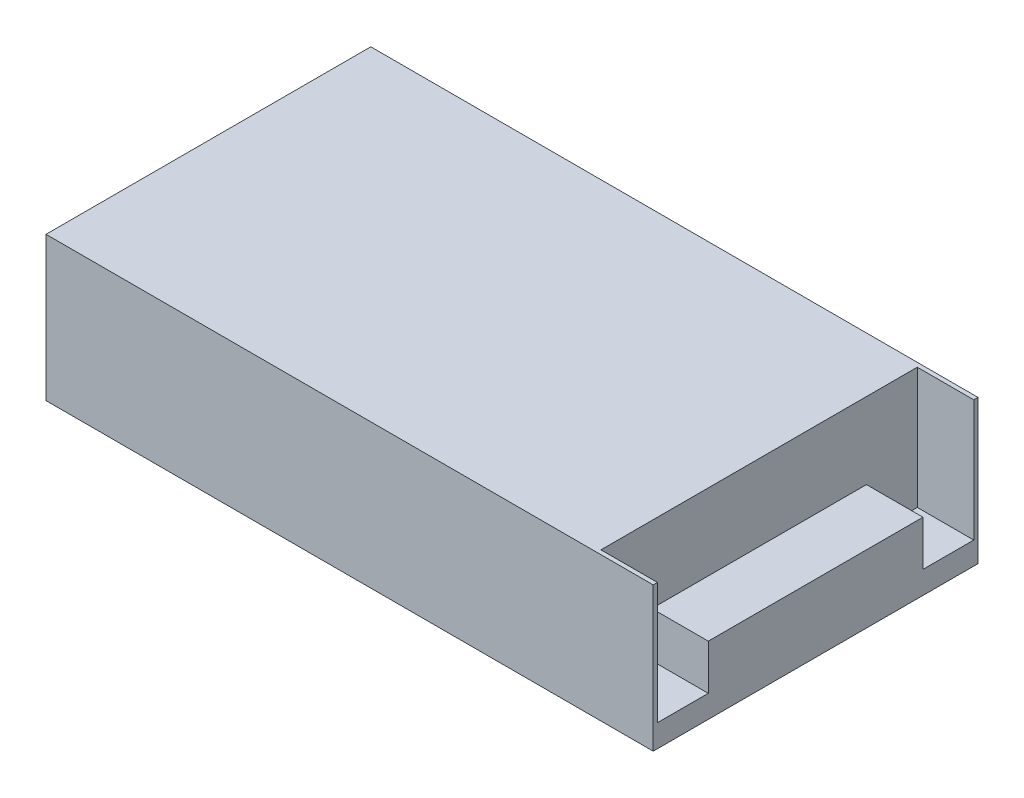
ISO-10303-21;
HEADER;
FILE_DESCRIPTION(('STEP AP214'),'2;1');
FILE_NAME('part.step','',(''),(''),'','','');
FILE_SCHEMA(('AUTOMOTIVE_DESIGN { 1 0 10303 214 1 1 1 1 }'));
ENDSEC;
DATA;
#1=APPLICATION_CONTEXT('core data for automotive mechanical design processes');
#2=APPLICATION_PROTOCOL_DEFINITION('international standard','automotive_design',2000,#1);
#3=PRODUCT_CONTEXT('',#1,'mechanical');
#4=PRODUCT('Part','Part','',(#3));
#5=PRODUCT_RELATED_PRODUCT_CATEGORY('part','',(#4));
#6=PRODUCT_DEFINITION_FORMATION('','',#4);
#7=PRODUCT_DEFINITION_CONTEXT('part definition',#1,'design');
#8=PRODUCT_DEFINITION('design','',#6,#7);
#9=PRODUCT_DEFINITION_SHAPE('','',#8);
#10=(LENGTH_UNIT() NAMED_UNIT(*) SI_UNIT(.MILLI.,.METRE.));
#11=(NAMED_UNIT(*) PLANE_ANGLE_UNIT() SI_UNIT($,.RADIAN.));
#12=(NAMED_UNIT(*) SI_UNIT($,.STERADIAN.) SOLID_ANGLE_UNIT());
#13=UNCERTAINTY_MEASURE_WITH_UNIT(LENGTH_MEASURE(1.E-05),#10,'distance_accuracy_value','');
#14=(GEOMETRIC_REPRESENTATION_CONTEXT(3) GLOBAL_UNCERTAINTY_ASSIGNED_CONTEXT((#13)) GLOBAL_UNIT_ASSIGNED_CONTEXT((#10,
#11,#12)) REPRESENTATION_CONTEXT('',''));
#15=CARTESIAN_POINT('',(0.,0.,0.));
#16=DIRECTION('',(0.,0.,1.));
#17=DIRECTION('',(1.,0.,0.));
#18=AXIS2_PLACEMENT_3D('',#15,#16,#17);
#19=CARTESIAN_POINT('',(107.5,51.,57.5));
#20=DIRECTION('',(-1.,0.,0.));
#21=DIRECTION('',(0.,0.,1.));
#22=AXIS2_PLACEMENT_3D('',#19,#20,#21);
#23=PLANE('',#22);
#24=DIRECTION('',(0.,0.,-1.));
#25=VECTOR('',#24,1.);
#26=CARTESIAN_POINT('',(107.5,51.,57.5));
#27=LINE('',#26,#25);
#28=CARTESIAN_POINT('',(107.5,51.,-56.));
#29=VERTEX_POINT('',#28);
#30=CARTESIAN_POINT('',(107.5,51.,-57.5));
#31=VERTEX_POINT('',#30);
#32=EDGE_CURVE('E89',#29,#31,#27,.T.);
#33=ORIENTED_EDGE('',*,*,#32,.F.);
#34=DIRECTION('',(0.,1.,0.));
#35=VECTOR('',#34,1.);
#36=CARTESIAN_POINT('',(107.5,51.,-56.));
#37=LINE('',#36,#35);
#38=CARTESIAN_POINT('',(107.5,8.,-56.));
#39=VERTEX_POINT('',#38);
#40=EDGE_CURVE('E147',#39,#29,#37,.T.);
#41=ORIENTED_EDGE('',*,*,#40,.F.);
#42=DIRECTION('',(0.,0.,-1.));
#43=VECTOR('',#42,1.);
#44=CARTESIAN_POINT('',(107.5,8.,-56.));
#45=LINE('',#44,#43);
#46=CARTESIAN_POINT('',(107.5,8.,-38.));
#47=VERTEX_POINT('',#46);
#48=EDGE_CURVE('E189',#47,#39,#45,.T.);
#49=ORIENTED_EDGE('',*,*,#48,.F.);
#50=DIRECTION('',(0.,-1.,0.));
#51=VECTOR('',#50,1.);
#52=CARTESIAN_POINT('',(107.5,24.,-38.));
#53=LINE('',#52,#51);
#54=CARTESIAN_POINT('',(107.5,24.,-38.));
#55=VERTEX_POINT('',#54);
#56=EDGE_CURVE('E186',#55,#47,#53,.T.);
#57=ORIENTED_EDGE('',*,*,#56,.F.);
#58=DIRECTION('',(0.,0.,-1.));
#59=VECTOR('',#58,1.);
#60=CARTESIAN_POINT('',(107.5,24.,38.));
#61=LINE('',#60,#59);
#62=CARTESIAN_POINT('',(107.5,24.,38.));
#63=VERTEX_POINT('',#62);
#64=EDGE_CURVE('E183',#63,#55,#61,.T.);
#65=ORIENTED_EDGE('',*,*,#64,.F.);
#66=DIRECTION('',(0.,1.,0.));
#67=VECTOR('',#66,1.);
#68=CARTESIAN_POINT('',(107.5,24.,38.));
#69=LINE('',#68,#67);
#70=CARTESIAN_POINT('',(107.5,8.,38.));
#71=VERTEX_POINT('',#70);
#72=EDGE_CURVE('E180',#71,#63,#69,.T.);
#73=ORIENTED_EDGE('',*,*,#72,.F.);
#74=DIRECTION('',(0.,0.,-1.));
#75=VECTOR('',#74,1.);
#76=CARTESIAN_POINT('',(107.5,8.,56.));
#77=LINE('',#76,#75);
#78=CARTESIAN_POINT('',(107.5,8.,56.));
#79=VERTEX_POINT('',#78);
#80=EDGE_CURVE('E178',#79,#71,#77,.T.);
#81=ORIENTED_EDGE('',*,*,#80,.F.);
#82=DIRECTION('',(0.,-1.,0.));
#83=VECTOR('',#82,1.);
#84=CARTESIAN_POINT('',(107.5,24.,56.));
#85=LINE('',#84,#83);
#86=CARTESIAN_POINT('',(107.5,51.,56.));
#87=VERTEX_POINT('',#86);
#88=EDGE_CURVE('E153',#87,#79,#85,.T.);
#89=ORIENTED_EDGE('',*,*,#88,.F.);
#90=CARTESIAN_POINT('',(107.5,51.,57.5));
#91=VERTEX_POINT('',#90);
#92=EDGE_CURVE('E206',#91,#87,#27,.T.);
#93=ORIENTED_EDGE('',*,*,#92,.F.);
#94=DIRECTION('',(0.,-1.,0.));
#95=VECTOR('',#94,1.);
#96=CARTESIAN_POINT('',(107.5,51.,57.5));
#97=LINE('',#96,#95);
#98=CARTESIAN_POINT('',(107.5,0.,57.5));
#99=VERTEX_POINT('',#98);
#100=EDGE_CURVE('E213',#91,#99,#97,.T.);
#101=ORIENTED_EDGE('',*,*,#100,.T.);
#102=DIRECTION('',(0.,0.,-1.));
#103=VECTOR('',#102,1.);
#104=CARTESIAN_POINT('',(107.5,0.,57.5));
#105=LINE('',#104,#103);
#106=CARTESIAN_POINT('',(107.5,0.,-57.5));
#107=VERTEX_POINT('',#106);
#108=EDGE_CURVE('E195',#99,#107,#105,.T.);
#109=ORIENTED_EDGE('',*,*,#108,.T.);
#110=DIRECTION('',(0.,-1.,0.));
#111=VECTOR('',#110,1.);
#112=CARTESIAN_POINT('',(107.5,51.,-57.5));
#113=LINE('',#112,#111);
#114=EDGE_CURVE('E11',#31,#107,#113,.T.);
#115=ORIENTED_EDGE('',*,*,#114,.F.);
#116=EDGE_LOOP('',(#33,#41,#49,#57,#65,#73,#81,#89,#93,#101,#109,#115));
#117=FACE_BOUND('',#116,.T.);
#118=ADVANCED_FACE('F39',(#117),#23,.F.);
#119=CARTESIAN_POINT('',(-107.5,51.,-57.5));
#120=DIRECTION('',(0.,0.,1.));
#121=DIRECTION('',(1.,0.,0.));
#122=AXIS2_PLACEMENT_3D('',#119,#120,#121);
#123=PLANE('',#122);
#124=DIRECTION('',(-1.,0.,0.));
#125=VECTOR('',#124,1.);
#126=CARTESIAN_POINT('',(-107.5,0.,-57.5));
#127=LINE('',#126,#125);
#128=CARTESIAN_POINT('',(-107.5,0.,-57.5));
#129=VERTEX_POINT('',#128);
#130=EDGE_CURVE('E216',#107,#129,#127,.T.);
#131=ORIENTED_EDGE('',*,*,#130,.T.);
#132=DIRECTION('',(0.,-1.,0.));
#133=VECTOR('',#132,1.);
#134=CARTESIAN_POINT('',(-107.5,51.,-57.5));
#135=LINE('',#134,#133);
#136=CARTESIAN_POINT('',(-107.5,51.,-57.5));
#137=VERTEX_POINT('',#136);
#138=EDGE_CURVE('E46',#137,#129,#135,.T.);
#139=ORIENTED_EDGE('',*,*,#138,.F.);
#140=DIRECTION('',(-1.,0.,0.));
#141=VECTOR('',#140,1.);
#142=CARTESIAN_POINT('',(-107.5,51.,-57.5));
#143=LINE('',#142,#141);
#144=EDGE_CURVE('E208',#31,#137,#143,.T.);
#145=ORIENTED_EDGE('',*,*,#144,.F.);
#146=ORIENTED_EDGE('',*,*,#114,.T.);
#147=EDGE_LOOP('',(#131,#139,#145,#146));
#148=FACE_BOUND('',#147,.T.);
#149=ADVANCED_FACE('F246',(#148),#123,.F.);
#150=CARTESIAN_POINT('',(-107.5,51.,57.5));
#151=DIRECTION('',(1.,0.,0.));
#152=DIRECTION('',(0.,0.,-1.));
#153=AXIS2_PLACEMENT_3D('',#150,#151,#152);
#154=PLANE('',#153);
#155=DIRECTION('',(0.,0.,1.));
#156=VECTOR('',#155,1.);
#157=CARTESIAN_POINT('',(-107.5,0.,57.5));
#158=LINE('',#157,#156);
#159=CARTESIAN_POINT('',(-107.5,0.,57.5));
#160=VERTEX_POINT('',#159);
#161=EDGE_CURVE('E218',#129,#160,#158,.T.);
#162=ORIENTED_EDGE('',*,*,#161,.T.);
#163=DIRECTION('',(0.,-1.,0.));
#164=VECTOR('',#163,1.);
#165=CARTESIAN_POINT('',(-107.5,51.,57.5));
#166=LINE('',#165,#164);
#167=CARTESIAN_POINT('',(-107.5,51.,57.5));
#168=VERTEX_POINT('',#167);
#169=EDGE_CURVE('E222',#168,#160,#166,.T.);
#170=ORIENTED_EDGE('',*,*,#169,.F.);
#171=DIRECTION('',(0.,0.,1.));
#172=VECTOR('',#171,1.);
#173=CARTESIAN_POINT('',(-107.5,51.,57.5));
#174=LINE('',#173,#172);
#175=EDGE_CURVE('E210',#137,#168,#174,.T.);
#176=ORIENTED_EDGE('',*,*,#175,.F.);
#177=ORIENTED_EDGE('',*,*,#138,.T.);
#178=EDGE_LOOP('',(#162,#170,#176,#177));
#179=FACE_BOUND('',#178,.T.);
#180=ADVANCED_FACE('F228',(#179),#154,.F.);
#181=CARTESIAN_POINT('',(-107.5,51.,57.5));
#182=DIRECTION('',(0.,0.,-1.));
#183=DIRECTION('',(-1.,0.,0.));
#184=AXIS2_PLACEMENT_3D('',#181,#182,#183);
#185=PLANE('',#184);
#186=DIRECTION('',(1.,0.,0.));
#187=VECTOR('',#186,1.);
#188=CARTESIAN_POINT('',(-107.5,0.,57.5));
#189=LINE('',#188,#187);
#190=EDGE_CURVE('E83',#160,#99,#189,.T.);
#191=ORIENTED_EDGE('',*,*,#190,.T.);
#192=ORIENTED_EDGE('',*,*,#100,.F.);
#193=DIRECTION('',(1.,0.,0.));
#194=VECTOR('',#193,1.);
#195=CARTESIAN_POINT('',(-107.5,51.,57.5));
#196=LINE('',#195,#194);
#197=EDGE_CURVE('E62',#168,#91,#196,.T.);
#198=ORIENTED_EDGE('',*,*,#197,.F.);
#199=ORIENTED_EDGE('',*,*,#169,.T.);
#200=EDGE_LOOP('',(#191,#192,#198,#199));
#201=FACE_BOUND('',#200,.T.);
#202=ADVANCED_FACE('F237',(#201),#185,.F.);
#203=CARTESIAN_POINT('',(0.,51.,0.));
#204=DIRECTION('',(0.,-1.,0.));
#205=DIRECTION('',(0.,0.,-1.));
#206=AXIS2_PLACEMENT_3D('',#203,#204,#205);
#207=PLANE('',#206);
#208=DIRECTION('',(0.,0.,1.));
#209=VECTOR('',#208,1.);
#210=CARTESIAN_POINT('',(87.5,51.,56.));
#211=LINE('',#210,#209);
#212=CARTESIAN_POINT('',(87.5,51.,-56.));
#213=VERTEX_POINT('',#212);
#214=CARTESIAN_POINT('',(87.5,51.,56.));
#215=VERTEX_POINT('',#214);
#216=EDGE_CURVE('E144',#213,#215,#211,.T.);
#217=ORIENTED_EDGE('',*,*,#216,.F.);
#218=DIRECTION('',(1.,0.,0.));
#219=VECTOR('',#218,1.);
#220=CARTESIAN_POINT('',(87.5,51.,-56.));
#221=LINE('',#220,#219);
#222=EDGE_CURVE('E53',#213,#29,#221,.T.);
#223=ORIENTED_EDGE('',*,*,#222,.T.);
#224=ORIENTED_EDGE('',*,*,#32,.T.);
#225=ORIENTED_EDGE('',*,*,#144,.T.);
#226=ORIENTED_EDGE('',*,*,#175,.T.);
#227=ORIENTED_EDGE('',*,*,#197,.T.);
#228=ORIENTED_EDGE('',*,*,#92,.T.);
#229=DIRECTION('',(1.,0.,0.));
#230=VECTOR('',#229,1.);
#231=CARTESIAN_POINT('',(87.5,51.,56.));
#232=LINE('',#231,#230);
#233=EDGE_CURVE('E193',#215,#87,#232,.T.);
#234=ORIENTED_EDGE('',*,*,#233,.F.);
#235=EDGE_LOOP('',(#217,#223,#224,#225,#226,#227,#228,#234));
#236=FACE_BOUND('',#235,.T.);
#237=ADVANCED_FACE('F239',(#236),#207,.F.);
#238=CARTESIAN_POINT('',(0.,0.,0.));
#239=DIRECTION('',(0.,-1.,0.));
#240=DIRECTION('',(0.,0.,-1.));
#241=AXIS2_PLACEMENT_3D('',#238,#239,#240);
#242=PLANE('',#241);
#243=ORIENTED_EDGE('',*,*,#108,.F.);
#244=ORIENTED_EDGE('',*,*,#190,.F.);
#245=ORIENTED_EDGE('',*,*,#161,.F.);
#246=ORIENTED_EDGE('',*,*,#130,.F.);
#247=EDGE_LOOP('',(#243,#244,#245,#246));
#248=FACE_BOUND('',#247,.T.);
#249=ADVANCED_FACE('F233',(#248),#242,.T.);
#250=CARTESIAN_POINT('',(87.5,51.,-56.));
#251=DIRECTION('',(0.,0.,-1.));
#252=DIRECTION('',(-1.,0.,0.));
#253=AXIS2_PLACEMENT_3D('',#250,#251,#252);
#254=PLANE('',#253);
#255=ORIENTED_EDGE('',*,*,#40,.T.);
#256=ORIENTED_EDGE('',*,*,#222,.F.);
#257=DIRECTION('',(0.,1.,0.));
#258=VECTOR('',#257,1.);
#259=CARTESIAN_POINT('',(87.5,24.,-56.));
#260=LINE('',#259,#258);
#261=CARTESIAN_POINT('',(87.5,8.,-56.));
#262=VERTEX_POINT('',#261);
#263=EDGE_CURVE('E174',#262,#213,#260,.T.);
#264=ORIENTED_EDGE('',*,*,#263,.F.);
#265=DIRECTION('',(1.,0.,0.));
#266=VECTOR('',#265,1.);
#267=CARTESIAN_POINT('',(87.5,8.,-56.));
#268=LINE('',#267,#266);
#269=EDGE_CURVE('E197',#262,#39,#268,.T.);
#270=ORIENTED_EDGE('',*,*,#269,.T.);
#271=EDGE_LOOP('',(#255,#256,#264,#270));
#272=FACE_BOUND('',#271,.T.);
#273=ADVANCED_FACE('F270',(#272),#254,.F.);
#274=CARTESIAN_POINT('',(87.5,8.,-56.));
#275=DIRECTION('',(0.,-1.,0.));
#276=DIRECTION('',(0.,0.,-1.));
#277=AXIS2_PLACEMENT_3D('',#274,#275,#276);
#278=PLANE('',#277);
#279=ORIENTED_EDGE('',*,*,#48,.T.);
#280=ORIENTED_EDGE('',*,*,#269,.F.);
#281=DIRECTION('',(0.,0.,-1.));
#282=VECTOR('',#281,1.);
#283=CARTESIAN_POINT('',(87.5,8.,-56.));
#284=LINE('',#283,#282);
#285=CARTESIAN_POINT('',(87.5,8.,-38.));
#286=VERTEX_POINT('',#285);
#287=EDGE_CURVE('E171',#286,#262,#284,.T.);
#288=ORIENTED_EDGE('',*,*,#287,.F.);
#289=DIRECTION('',(1.,0.,0.));
#290=VECTOR('',#289,1.);
#291=CARTESIAN_POINT('',(87.5,8.,-38.));
#292=LINE('',#291,#290);
#293=EDGE_CURVE('E199',#286,#47,#292,.T.);
#294=ORIENTED_EDGE('',*,*,#293,.T.);
#295=EDGE_LOOP('',(#279,#280,#288,#294));
#296=FACE_BOUND('',#295,.T.);
#297=ADVANCED_FACE('F269',(#296),#278,.F.);
#298=CARTESIAN_POINT('',(87.5,24.,-38.));
#299=DIRECTION('',(0.,0.,1.));
#300=DIRECTION('',(1.,0.,0.));
#301=AXIS2_PLACEMENT_3D('',#298,#299,#300);
#302=PLANE('',#301);
#303=ORIENTED_EDGE('',*,*,#56,.T.);
#304=ORIENTED_EDGE('',*,*,#293,.F.);
#305=DIRECTION('',(0.,-1.,0.));
#306=VECTOR('',#305,1.);
#307=CARTESIAN_POINT('',(87.5,24.,-38.));
#308=LINE('',#307,#306);
#309=CARTESIAN_POINT('',(87.5,24.,-38.));
#310=VERTEX_POINT('',#309);
#311=EDGE_CURVE('E168',#310,#286,#308,.T.);
#312=ORIENTED_EDGE('',*,*,#311,.F.);
#313=DIRECTION('',(1.,0.,0.));
#314=VECTOR('',#313,1.);
#315=CARTESIAN_POINT('',(87.5,24.,-38.));
#316=LINE('',#315,#314);
#317=EDGE_CURVE('E201',#310,#55,#316,.T.);
#318=ORIENTED_EDGE('',*,*,#317,.T.);
#319=EDGE_LOOP('',(#303,#304,#312,#318));
#320=FACE_BOUND('',#319,.T.);
#321=ADVANCED_FACE('F265',(#320),#302,.F.);
#322=CARTESIAN_POINT('',(87.5,24.,38.));
#323=DIRECTION('',(0.,-1.,0.));
#324=DIRECTION('',(0.,0.,-1.));
#325=AXIS2_PLACEMENT_3D('',#322,#323,#324);
#326=PLANE('',#325);
#327=ORIENTED_EDGE('',*,*,#64,.T.);
#328=ORIENTED_EDGE('',*,*,#317,.F.);
#329=DIRECTION('',(0.,0.,-1.));
#330=VECTOR('',#329,1.);
#331=CARTESIAN_POINT('',(87.5,24.,38.));
#332=LINE('',#331,#330);
#333=CARTESIAN_POINT('',(87.5,24.,38.));
#334=VERTEX_POINT('',#333);
#335=EDGE_CURVE('E163',#334,#310,#332,.T.);
#336=ORIENTED_EDGE('',*,*,#335,.F.);
#337=DIRECTION('',(1.,0.,0.));
#338=VECTOR('',#337,1.);
#339=CARTESIAN_POINT('',(87.5,24.,38.));
#340=LINE('',#339,#338);
#341=EDGE_CURVE('E203',#334,#63,#340,.T.);
#342=ORIENTED_EDGE('',*,*,#341,.T.);
#343=EDGE_LOOP('',(#327,#328,#336,#342));
#344=FACE_BOUND('',#343,.T.);
#345=ADVANCED_FACE('F263',(#344),#326,.F.);
#346=CARTESIAN_POINT('',(87.5,24.,38.));
#347=DIRECTION('',(0.,0.,-1.));
#348=DIRECTION('',(-1.,0.,0.));
#349=AXIS2_PLACEMENT_3D('',#346,#347,#348);
#350=PLANE('',#349);
#351=ORIENTED_EDGE('',*,*,#72,.T.);
#352=ORIENTED_EDGE('',*,*,#341,.F.);
#353=DIRECTION('',(0.,1.,0.));
#354=VECTOR('',#353,1.);
#355=CARTESIAN_POINT('',(87.5,24.,38.));
#356=LINE('',#355,#354);
#357=CARTESIAN_POINT('',(87.5,8.,38.));
#358=VERTEX_POINT('',#357);
#359=EDGE_CURVE('E161',#358,#334,#356,.T.);
#360=ORIENTED_EDGE('',*,*,#359,.F.);
#361=DIRECTION('',(1.,0.,0.));
#362=VECTOR('',#361,1.);
#363=CARTESIAN_POINT('',(87.5,8.,38.));
#364=LINE('',#363,#362);
#365=EDGE_CURVE('E157',#358,#71,#364,.T.);
#366=ORIENTED_EDGE('',*,*,#365,.T.);
#367=EDGE_LOOP('',(#351,#352,#360,#366));
#368=FACE_BOUND('',#367,.T.);
#369=ADVANCED_FACE('F259',(#368),#350,.F.);
#370=CARTESIAN_POINT('',(87.5,8.,56.));
#371=DIRECTION('',(0.,-1.,0.));
#372=DIRECTION('',(0.,0.,-1.));
#373=AXIS2_PLACEMENT_3D('',#370,#371,#372);
#374=PLANE('',#373);
#375=ORIENTED_EDGE('',*,*,#80,.T.);
#376=ORIENTED_EDGE('',*,*,#365,.F.);
#377=DIRECTION('',(0.,0.,-1.));
#378=VECTOR('',#377,1.);
#379=CARTESIAN_POINT('',(87.5,8.,56.));
#380=LINE('',#379,#378);
#381=CARTESIAN_POINT('',(87.5,8.,56.));
#382=VERTEX_POINT('',#381);
#383=EDGE_CURVE('E142',#382,#358,#380,.T.);
#384=ORIENTED_EDGE('',*,*,#383,.F.);
#385=DIRECTION('',(1.,0.,0.));
#386=VECTOR('',#385,1.);
#387=CARTESIAN_POINT('',(87.5,8.,56.));
#388=LINE('',#387,#386);
#389=EDGE_CURVE('E150',#382,#79,#388,.T.);
#390=ORIENTED_EDGE('',*,*,#389,.T.);
#391=EDGE_LOOP('',(#375,#376,#384,#390));
#392=FACE_BOUND('',#391,.T.);
#393=ADVANCED_FACE('F159',(#392),#374,.F.);
#394=CARTESIAN_POINT('',(87.5,24.,56.));
#395=DIRECTION('',(0.,0.,1.));
#396=DIRECTION('',(1.,0.,0.));
#397=AXIS2_PLACEMENT_3D('',#394,#395,#396);
#398=PLANE('',#397);
#399=ORIENTED_EDGE('',*,*,#88,.T.);
#400=ORIENTED_EDGE('',*,*,#389,.F.);
#401=DIRECTION('',(0.,-1.,0.));
#402=VECTOR('',#401,1.);
#403=CARTESIAN_POINT('',(87.5,51.,56.));
#404=LINE('',#403,#402);
#405=EDGE_CURVE('E137',#215,#382,#404,.T.);
#406=ORIENTED_EDGE('',*,*,#405,.F.);
#407=ORIENTED_EDGE('',*,*,#233,.T.);
#408=EDGE_LOOP('',(#399,#400,#406,#407));
#409=FACE_BOUND('',#408,.T.);
#410=ADVANCED_FACE('F151',(#409),#398,.F.);
#411=CARTESIAN_POINT('',(87.5,0.,0.));
#412=DIRECTION('',(1.,0.,0.));
#413=DIRECTION('',(0.,0.,-1.));
#414=AXIS2_PLACEMENT_3D('',#411,#412,#413);
#415=PLANE('',#414);
#416=ORIENTED_EDGE('',*,*,#405,.T.);
#417=ORIENTED_EDGE('',*,*,#383,.T.);
#418=ORIENTED_EDGE('',*,*,#359,.T.);
#419=ORIENTED_EDGE('',*,*,#335,.T.);
#420=ORIENTED_EDGE('',*,*,#311,.T.);
#421=ORIENTED_EDGE('',*,*,#287,.T.);
#422=ORIENTED_EDGE('',*,*,#263,.T.);
#423=ORIENTED_EDGE('',*,*,#216,.T.);
#424=EDGE_LOOP('',(#416,#417,#418,#419,#420,#421,#422,#423));
#425=FACE_BOUND('',#424,.T.);
#426=ADVANCED_FACE('F139',(#425),#415,.T.);
#427=CLOSED_SHELL('',(#118,#149,#180,#202,#237,#249,#273,#297,#321,#345,#369,#393,#410,#426));
#428=MANIFOLD_SOLID_BREP('B2',#427);
#429=ADVANCED_BREP_SHAPE_REPRESENTATION('',(#18,#428),#14);
#430=SHAPE_DEFINITION_REPRESENTATION(#9,#429);
ENDSEC;
END-ISO-10303-21;
